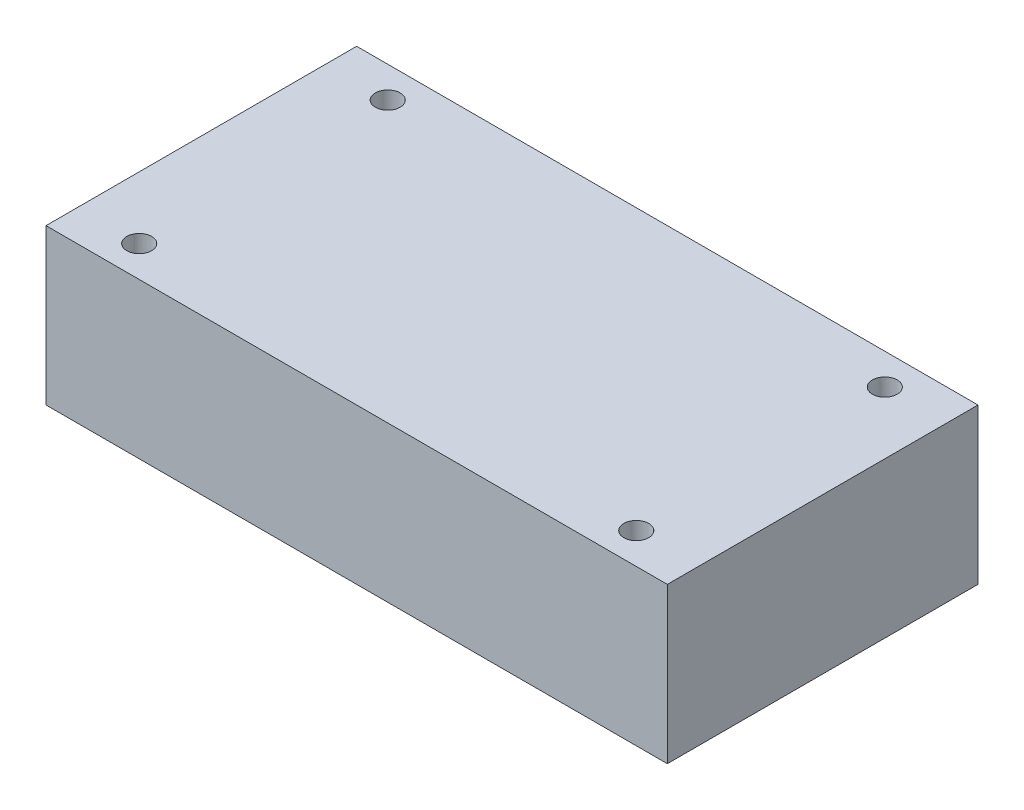
ISO-10303-21;
HEADER;
FILE_DESCRIPTION(('STEP AP214'),'2;1');
FILE_NAME('part.step','',(''),(''),'','','');
FILE_SCHEMA(('AUTOMOTIVE_DESIGN { 1 0 10303 214 1 1 1 1 }'));
ENDSEC;
DATA;
#1=APPLICATION_CONTEXT('core data for automotive mechanical design processes');
#2=APPLICATION_PROTOCOL_DEFINITION('international standard','automotive_design',2000,#1);
#3=PRODUCT_CONTEXT('',#1,'mechanical');
#4=PRODUCT('Part','Part','',(#3));
#5=PRODUCT_RELATED_PRODUCT_CATEGORY('part','',(#4));
#6=PRODUCT_DEFINITION_FORMATION('','',#4);
#7=PRODUCT_DEFINITION_CONTEXT('part definition',#1,'design');
#8=PRODUCT_DEFINITION('design','',#6,#7);
#9=PRODUCT_DEFINITION_SHAPE('','',#8);
#10=(LENGTH_UNIT() NAMED_UNIT(*) SI_UNIT(.MILLI.,.METRE.));
#11=(NAMED_UNIT(*) PLANE_ANGLE_UNIT() SI_UNIT($,.RADIAN.));
#12=(NAMED_UNIT(*) SI_UNIT($,.STERADIAN.) SOLID_ANGLE_UNIT());
#13=UNCERTAINTY_MEASURE_WITH_UNIT(LENGTH_MEASURE(1.E-05),#10,'distance_accuracy_value','');
#14=(GEOMETRIC_REPRESENTATION_CONTEXT(3) GLOBAL_UNCERTAINTY_ASSIGNED_CONTEXT((#13)) GLOBAL_UNIT_ASSIGNED_CONTEXT((#10,
#11,#12)) REPRESENTATION_CONTEXT('',''));
#15=CARTESIAN_POINT('',(0.,0.,0.));
#16=DIRECTION('',(0.,0.,1.));
#17=DIRECTION('',(1.,0.,0.));
#18=AXIS2_PLACEMENT_3D('',#15,#16,#17);
#19=CARTESIAN_POINT('',(0.,25.,0.));
#20=DIRECTION('',(1.,0.,0.));
#21=DIRECTION('',(0.,0.,-1.));
#22=AXIS2_PLACEMENT_3D('',#19,#20,#21);
#23=PLANE('',#22);
#24=DIRECTION('',(0.,0.,1.));
#25=VECTOR('',#24,1.);
#26=CARTESIAN_POINT('',(0.,0.,0.));
#27=LINE('',#26,#25);
#28=CARTESIAN_POINT('',(0.,0.,-50.));
#29=VERTEX_POINT('',#28);
#30=CARTESIAN_POINT('',(0.,0.,0.));
#31=VERTEX_POINT('',#30);
#32=EDGE_CURVE('E98',#29,#31,#27,.T.);
#33=ORIENTED_EDGE('',*,*,#32,.T.);
#34=DIRECTION('',(0.,-1.,0.));
#35=VECTOR('',#34,1.);
#36=CARTESIAN_POINT('',(0.,25.,0.));
#37=LINE('',#36,#35);
#38=CARTESIAN_POINT('',(0.,25.,0.));
#39=VERTEX_POINT('',#38);
#40=EDGE_CURVE('E11',#39,#31,#37,.T.);
#41=ORIENTED_EDGE('',*,*,#40,.F.);
#42=DIRECTION('',(0.,0.,1.));
#43=VECTOR('',#42,1.);
#44=CARTESIAN_POINT('',(0.,25.,0.));
#45=LINE('',#44,#43);
#46=CARTESIAN_POINT('',(0.,25.,-50.));
#47=VERTEX_POINT('',#46);
#48=EDGE_CURVE('E86',#47,#39,#45,.T.);
#49=ORIENTED_EDGE('',*,*,#48,.F.);
#50=DIRECTION('',(0.,-1.,0.));
#51=VECTOR('',#50,1.);
#52=CARTESIAN_POINT('',(0.,25.,-50.));
#53=LINE('',#52,#51);
#54=EDGE_CURVE('E94',#47,#29,#53,.T.);
#55=ORIENTED_EDGE('',*,*,#54,.T.);
#56=EDGE_LOOP('',(#33,#41,#49,#55));
#57=FACE_BOUND('',#56,.T.);
#58=ADVANCED_FACE('F35',(#57),#23,.F.);
#59=CARTESIAN_POINT('',(0.,25.,0.));
#60=DIRECTION('',(0.,0.,-1.));
#61=DIRECTION('',(-1.,0.,0.));
#62=AXIS2_PLACEMENT_3D('',#59,#60,#61);
#63=PLANE('',#62);
#64=DIRECTION('',(1.,0.,0.));
#65=VECTOR('',#64,1.);
#66=CARTESIAN_POINT('',(0.,0.,0.));
#67=LINE('',#66,#65);
#68=CARTESIAN_POINT('',(100.,0.,0.));
#69=VERTEX_POINT('',#68);
#70=EDGE_CURVE('E90',#31,#69,#67,.T.);
#71=ORIENTED_EDGE('',*,*,#70,.T.);
#72=DIRECTION('',(0.,-1.,0.));
#73=VECTOR('',#72,1.);
#74=CARTESIAN_POINT('',(100.,25.,0.));
#75=LINE('',#74,#73);
#76=CARTESIAN_POINT('',(100.,25.,0.));
#77=VERTEX_POINT('',#76);
#78=EDGE_CURVE('E43',#77,#69,#75,.T.);
#79=ORIENTED_EDGE('',*,*,#78,.F.);
#80=DIRECTION('',(1.,0.,0.));
#81=VECTOR('',#80,1.);
#82=CARTESIAN_POINT('',(0.,25.,0.));
#83=LINE('',#82,#81);
#84=EDGE_CURVE('E81',#39,#77,#83,.T.);
#85=ORIENTED_EDGE('',*,*,#84,.F.);
#86=ORIENTED_EDGE('',*,*,#40,.T.);
#87=EDGE_LOOP('',(#71,#79,#85,#86));
#88=FACE_BOUND('',#87,.T.);
#89=ADVANCED_FACE('F89',(#88),#63,.F.);
#90=CARTESIAN_POINT('',(100.,25.,0.));
#91=DIRECTION('',(-1.,0.,0.));
#92=DIRECTION('',(0.,0.,1.));
#93=AXIS2_PLACEMENT_3D('',#90,#91,#92);
#94=PLANE('',#93);
#95=DIRECTION('',(0.,0.,-1.));
#96=VECTOR('',#95,1.);
#97=CARTESIAN_POINT('',(100.,0.,0.));
#98=LINE('',#97,#96);
#99=CARTESIAN_POINT('',(100.,0.,-50.));
#100=VERTEX_POINT('',#99);
#101=EDGE_CURVE('E68',#69,#100,#98,.T.);
#102=ORIENTED_EDGE('',*,*,#101,.T.);
#103=DIRECTION('',(0.,-1.,0.));
#104=VECTOR('',#103,1.);
#105=CARTESIAN_POINT('',(100.,25.,-50.));
#106=LINE('',#105,#104);
#107=CARTESIAN_POINT('',(100.,25.,-50.));
#108=VERTEX_POINT('',#107);
#109=EDGE_CURVE('E91',#108,#100,#106,.T.);
#110=ORIENTED_EDGE('',*,*,#109,.F.);
#111=DIRECTION('',(0.,0.,-1.));
#112=VECTOR('',#111,1.);
#113=CARTESIAN_POINT('',(100.,25.,0.));
#114=LINE('',#113,#112);
#115=EDGE_CURVE('E84',#77,#108,#114,.T.);
#116=ORIENTED_EDGE('',*,*,#115,.F.);
#117=ORIENTED_EDGE('',*,*,#78,.T.);
#118=EDGE_LOOP('',(#102,#110,#116,#117));
#119=FACE_BOUND('',#118,.T.);
#120=ADVANCED_FACE('F92',(#119),#94,.F.);
#121=CARTESIAN_POINT('',(0.,25.,-50.));
#122=DIRECTION('',(0.,0.,1.));
#123=DIRECTION('',(1.,0.,0.));
#124=AXIS2_PLACEMENT_3D('',#121,#122,#123);
#125=PLANE('',#124);
#126=DIRECTION('',(-1.,0.,0.));
#127=VECTOR('',#126,1.);
#128=CARTESIAN_POINT('',(0.,0.,-50.));
#129=LINE('',#128,#127);
#130=EDGE_CURVE('E74',#100,#29,#129,.T.);
#131=ORIENTED_EDGE('',*,*,#130,.T.);
#132=ORIENTED_EDGE('',*,*,#54,.F.);
#133=DIRECTION('',(-1.,0.,0.));
#134=VECTOR('',#133,1.);
#135=CARTESIAN_POINT('',(0.,25.,-50.));
#136=LINE('',#135,#134);
#137=EDGE_CURVE('E51',#108,#47,#136,.T.);
#138=ORIENTED_EDGE('',*,*,#137,.F.);
#139=ORIENTED_EDGE('',*,*,#109,.T.);
#140=EDGE_LOOP('',(#131,#132,#138,#139));
#141=FACE_BOUND('',#140,.T.);
#142=ADVANCED_FACE('F106',(#141),#125,.F.);
#143=CARTESIAN_POINT('',(0.,25.,0.));
#144=DIRECTION('',(0.,-1.,0.));
#145=DIRECTION('',(0.,0.,-1.));
#146=AXIS2_PLACEMENT_3D('',#143,#144,#145);
#147=PLANE('',#146);
#148=CARTESIAN_POINT('',(90.,25.,-5.));
#149=DIRECTION('',(0.,1.,0.));
#150=DIRECTION('',(0.,0.,1.));
#151=AXIS2_PLACEMENT_3D('',#148,#149,#150);
#152=CIRCLE('',#151,2.);
#153=CARTESIAN_POINT('',(90.,25.,-3.));
#154=VERTEX_POINT('',#153);
#155=EDGE_CURVE('E125',#154,#154,#152,.T.);
#156=ORIENTED_EDGE('',*,*,#155,.F.);
#157=EDGE_LOOP('',(#156));
#158=FACE_BOUND('',#157,.T.);
#159=CARTESIAN_POINT('',(10.,25.,-45.));
#160=DIRECTION('',(0.,1.,0.));
#161=DIRECTION('',(0.,0.,1.));
#162=AXIS2_PLACEMENT_3D('',#159,#160,#161);
#163=CIRCLE('',#162,2.);
#164=CARTESIAN_POINT('',(10.,25.,-43.));
#165=VERTEX_POINT('',#164);
#166=EDGE_CURVE('E118',#165,#165,#163,.T.);
#167=ORIENTED_EDGE('',*,*,#166,.F.);
#168=EDGE_LOOP('',(#167));
#169=FACE_BOUND('',#168,.T.);
#170=CARTESIAN_POINT('',(90.,25.,-45.));
#171=DIRECTION('',(0.,1.,0.));
#172=DIRECTION('',(0.,0.,1.));
#173=AXIS2_PLACEMENT_3D('',#170,#171,#172);
#174=CIRCLE('',#173,2.);
#175=CARTESIAN_POINT('',(90.,25.,-43.));
#176=VERTEX_POINT('',#175);
#177=EDGE_CURVE('E130',#176,#176,#174,.T.);
#178=ORIENTED_EDGE('',*,*,#177,.F.);
#179=EDGE_LOOP('',(#178));
#180=FACE_BOUND('',#179,.T.);
#181=CARTESIAN_POINT('',(10.,25.,-5.));
#182=DIRECTION('',(0.,1.,0.));
#183=DIRECTION('',(0.,0.,1.));
#184=AXIS2_PLACEMENT_3D('',#181,#182,#183);
#185=CIRCLE('',#184,2.);
#186=CARTESIAN_POINT('',(10.,25.,-3.));
#187=VERTEX_POINT('',#186);
#188=EDGE_CURVE('E112',#187,#187,#185,.T.);
#189=ORIENTED_EDGE('',*,*,#188,.F.);
#190=EDGE_LOOP('',(#189));
#191=FACE_BOUND('',#190,.T.);
#192=ORIENTED_EDGE('',*,*,#48,.T.);
#193=ORIENTED_EDGE('',*,*,#84,.T.);
#194=ORIENTED_EDGE('',*,*,#115,.T.);
#195=ORIENTED_EDGE('',*,*,#137,.T.);
#196=EDGE_LOOP('',(#192,#193,#194,#195));
#197=FACE_BOUND('',#196,.T.);
#198=ADVANCED_FACE('F82',(#158,#169,#180,#191,#197),#147,.F.);
#199=CARTESIAN_POINT('',(0.,0.,0.));
#200=DIRECTION('',(0.,-1.,0.));
#201=DIRECTION('',(0.,0.,-1.));
#202=AXIS2_PLACEMENT_3D('',#199,#200,#201);
#203=PLANE('',#202);
#204=CARTESIAN_POINT('',(90.,0.,-5.));
#205=DIRECTION('',(0.,1.,0.));
#206=DIRECTION('',(0.,0.,1.));
#207=AXIS2_PLACEMENT_3D('',#204,#205,#206);
#208=CIRCLE('',#207,2.);
#209=CARTESIAN_POINT('',(90.,0.,-3.));
#210=VERTEX_POINT('',#209);
#211=EDGE_CURVE('E115',#210,#210,#208,.T.);
#212=ORIENTED_EDGE('',*,*,#211,.T.);
#213=EDGE_LOOP('',(#212));
#214=FACE_BOUND('',#213,.T.);
#215=CARTESIAN_POINT('',(10.,0.,-45.));
#216=DIRECTION('',(0.,1.,0.));
#217=DIRECTION('',(0.,0.,1.));
#218=AXIS2_PLACEMENT_3D('',#215,#216,#217);
#219=CIRCLE('',#218,2.);
#220=CARTESIAN_POINT('',(10.,0.,-43.));
#221=VERTEX_POINT('',#220);
#222=EDGE_CURVE('E121',#221,#221,#219,.T.);
#223=ORIENTED_EDGE('',*,*,#222,.T.);
#224=EDGE_LOOP('',(#223));
#225=FACE_BOUND('',#224,.T.);
#226=CARTESIAN_POINT('',(90.,0.,-45.));
#227=DIRECTION('',(0.,1.,0.));
#228=DIRECTION('',(0.,0.,1.));
#229=AXIS2_PLACEMENT_3D('',#226,#227,#228);
#230=CIRCLE('',#229,2.);
#231=CARTESIAN_POINT('',(90.,0.,-43.));
#232=VERTEX_POINT('',#231);
#233=EDGE_CURVE('E122',#232,#232,#230,.T.);
#234=ORIENTED_EDGE('',*,*,#233,.T.);
#235=EDGE_LOOP('',(#234));
#236=FACE_BOUND('',#235,.T.);
#237=CARTESIAN_POINT('',(10.,0.,-5.));
#238=DIRECTION('',(0.,1.,0.));
#239=DIRECTION('',(0.,0.,1.));
#240=AXIS2_PLACEMENT_3D('',#237,#238,#239);
#241=CIRCLE('',#240,2.);
#242=CARTESIAN_POINT('',(10.,0.,-3.));
#243=VERTEX_POINT('',#242);
#244=EDGE_CURVE('E101',#243,#243,#241,.T.);
#245=ORIENTED_EDGE('',*,*,#244,.T.);
#246=EDGE_LOOP('',(#245));
#247=FACE_BOUND('',#246,.T.);
#248=ORIENTED_EDGE('',*,*,#32,.F.);
#249=ORIENTED_EDGE('',*,*,#130,.F.);
#250=ORIENTED_EDGE('',*,*,#101,.F.);
#251=ORIENTED_EDGE('',*,*,#70,.F.);
#252=EDGE_LOOP('',(#248,#249,#250,#251));
#253=FACE_BOUND('',#252,.T.);
#254=ADVANCED_FACE('F109',(#214,#225,#236,#247,#253),#203,.T.);
#255=CARTESIAN_POINT('',(10.,0.,-5.));
#256=DIRECTION('',(0.,1.,0.));
#257=DIRECTION('',(0.,0.,1.));
#258=AXIS2_PLACEMENT_3D('',#255,#256,#257);
#259=CYLINDRICAL_SURFACE('',#258,2.);
#260=ORIENTED_EDGE('',*,*,#244,.F.);
#261=EDGE_LOOP('',(#260));
#262=FACE_BOUND('',#261,.T.);
#263=ORIENTED_EDGE('',*,*,#188,.T.);
#264=EDGE_LOOP('',(#263));
#265=FACE_BOUND('',#264,.T.);
#266=ADVANCED_FACE('F142',(#262,#265),#259,.F.);
#267=CARTESIAN_POINT('',(90.,0.,-45.));
#268=DIRECTION('',(0.,1.,0.));
#269=DIRECTION('',(0.,0.,1.));
#270=AXIS2_PLACEMENT_3D('',#267,#268,#269);
#271=CYLINDRICAL_SURFACE('',#270,2.);
#272=ORIENTED_EDGE('',*,*,#233,.F.);
#273=EDGE_LOOP('',(#272));
#274=FACE_BOUND('',#273,.T.);
#275=ORIENTED_EDGE('',*,*,#177,.T.);
#276=EDGE_LOOP('',(#275));
#277=FACE_BOUND('',#276,.T.);
#278=ADVANCED_FACE('F138',(#274,#277),#271,.F.);
#279=CARTESIAN_POINT('',(10.,0.,-45.));
#280=DIRECTION('',(0.,1.,0.));
#281=DIRECTION('',(0.,0.,1.));
#282=AXIS2_PLACEMENT_3D('',#279,#280,#281);
#283=CYLINDRICAL_SURFACE('',#282,2.);
#284=ORIENTED_EDGE('',*,*,#222,.F.);
#285=EDGE_LOOP('',(#284));
#286=FACE_BOUND('',#285,.T.);
#287=ORIENTED_EDGE('',*,*,#166,.T.);
#288=EDGE_LOOP('',(#287));
#289=FACE_BOUND('',#288,.T.);
#290=ADVANCED_FACE('F141',(#286,#289),#283,.F.);
#291=CARTESIAN_POINT('',(90.,0.,-5.));
#292=DIRECTION('',(0.,1.,0.));
#293=DIRECTION('',(0.,0.,1.));
#294=AXIS2_PLACEMENT_3D('',#291,#292,#293);
#295=CYLINDRICAL_SURFACE('',#294,2.);
#296=ORIENTED_EDGE('',*,*,#211,.F.);
#297=EDGE_LOOP('',(#296));
#298=FACE_BOUND('',#297,.T.);
#299=ORIENTED_EDGE('',*,*,#155,.T.);
#300=EDGE_LOOP('',(#299));
#301=FACE_BOUND('',#300,.T.);
#302=ADVANCED_FACE('F203',(#298,#301),#295,.F.);
#303=CLOSED_SHELL('',(#58,#89,#120,#142,#198,#254,#266,#278,#290,#302));
#304=MANIFOLD_SOLID_BREP('B2',#303);
#305=ADVANCED_BREP_SHAPE_REPRESENTATION('',(#18,#304),#14);
#306=SHAPE_DEFINITION_REPRESENTATION(#9,#305);
ENDSEC;
END-ISO-10303-21;
